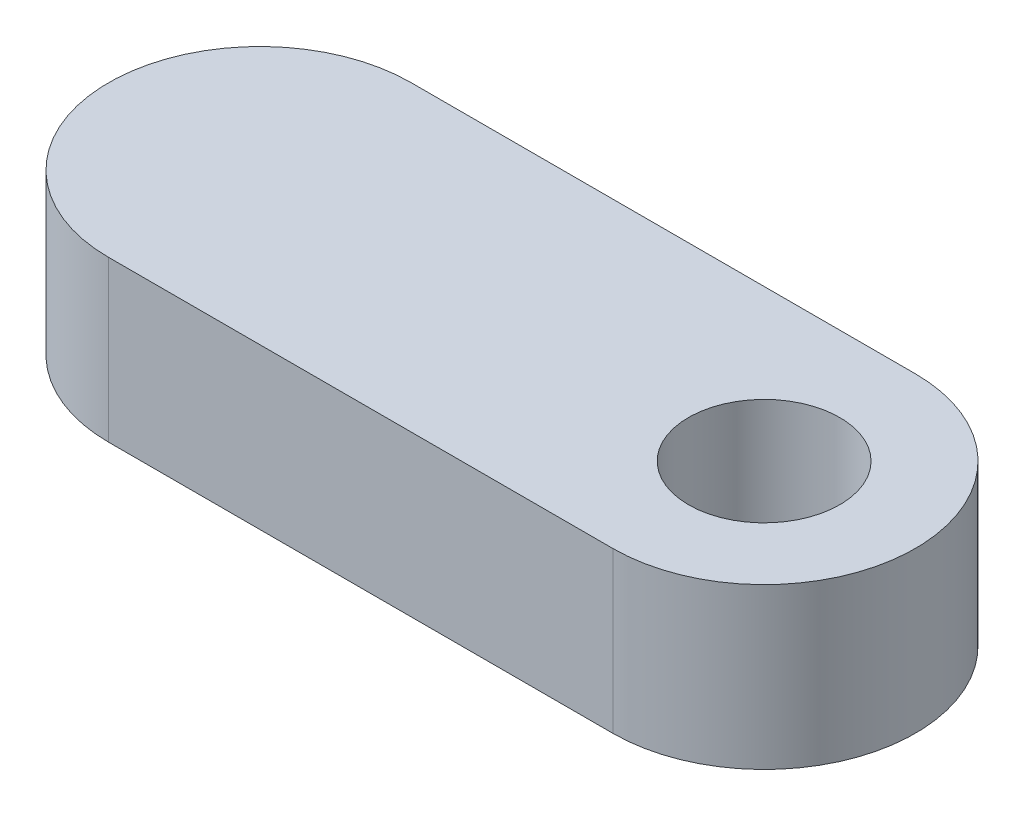
ISO-10303-21;
HEADER;
FILE_DESCRIPTION(('STEP AP214'),'2;1');
FILE_NAME('part.step','',(''),(''),'','','');
FILE_SCHEMA(('AUTOMOTIVE_DESIGN { 1 0 10303 214 1 1 1 1 }'));
ENDSEC;
DATA;
#1=APPLICATION_CONTEXT('core data for automotive mechanical design processes');
#2=APPLICATION_PROTOCOL_DEFINITION('international standard','automotive_design',2000,#1);
#3=PRODUCT_CONTEXT('',#1,'mechanical');
#4=PRODUCT('Part','Part','',(#3));
#5=PRODUCT_RELATED_PRODUCT_CATEGORY('part','',(#4));
#6=PRODUCT_DEFINITION_FORMATION('','',#4);
#7=PRODUCT_DEFINITION_CONTEXT('part definition',#1,'design');
#8=PRODUCT_DEFINITION('design','',#6,#7);
#9=PRODUCT_DEFINITION_SHAPE('','',#8);
#10=(LENGTH_UNIT() NAMED_UNIT(*) SI_UNIT(.MILLI.,.METRE.));
#11=(NAMED_UNIT(*) PLANE_ANGLE_UNIT() SI_UNIT($,.RADIAN.));
#12=(NAMED_UNIT(*) SI_UNIT($,.STERADIAN.) SOLID_ANGLE_UNIT());
#13=UNCERTAINTY_MEASURE_WITH_UNIT(LENGTH_MEASURE(1.E-05),#10,'distance_accuracy_value','');
#14=(GEOMETRIC_REPRESENTATION_CONTEXT(3) GLOBAL_UNCERTAINTY_ASSIGNED_CONTEXT((#13)) GLOBAL_UNIT_ASSIGNED_CONTEXT((#10,
#11,#12)) REPRESENTATION_CONTEXT('',''));
#15=CARTESIAN_POINT('',(0.,0.,0.));
#16=DIRECTION('',(0.,0.,1.));
#17=DIRECTION('',(1.,0.,0.));
#18=AXIS2_PLACEMENT_3D('',#15,#16,#17);
#19=CARTESIAN_POINT('',(-5.,3.175,0.));
#20=DIRECTION('',(0.,1.,0.));
#21=DIRECTION('',(0.,0.,1.));
#22=AXIS2_PLACEMENT_3D('',#19,#20,#21);
#23=PLANE('',#22);
#24=CARTESIAN_POINT('',(-5.,3.175,0.));
#25=DIRECTION('',(0.,1.,0.));
#26=DIRECTION('',(0.,0.,1.));
#27=AXIS2_PLACEMENT_3D('',#24,#25,#26);
#28=CIRCLE('',#27,3.);
#29=CARTESIAN_POINT('',(-5.,3.175,-3.));
#30=VERTEX_POINT('',#29);
#31=CARTESIAN_POINT('',(-5.,3.175,3.));
#32=VERTEX_POINT('',#31);
#33=EDGE_CURVE('E92',#30,#32,#28,.T.);
#34=ORIENTED_EDGE('',*,*,#33,.T.);
#35=DIRECTION('',(1.,0.,0.));
#36=VECTOR('',#35,1.);
#37=CARTESIAN_POINT('',(5.,3.175,3.));
#38=LINE('',#37,#36);
#39=CARTESIAN_POINT('',(5.,3.175,3.));
#40=VERTEX_POINT('',#39);
#41=EDGE_CURVE('E87',#32,#40,#38,.T.);
#42=ORIENTED_EDGE('',*,*,#41,.T.);
#43=CARTESIAN_POINT('',(5.,3.175,0.));
#44=DIRECTION('',(0.,1.,0.));
#45=DIRECTION('',(0.,0.,-1.));
#46=AXIS2_PLACEMENT_3D('',#43,#44,#45);
#47=CIRCLE('',#46,3.);
#48=CARTESIAN_POINT('',(5.,3.175,-3.));
#49=VERTEX_POINT('',#48);
#50=EDGE_CURVE('E90',#40,#49,#47,.T.);
#51=ORIENTED_EDGE('',*,*,#50,.T.);
#52=DIRECTION('',(-1.,0.,0.));
#53=VECTOR('',#52,1.);
#54=CARTESIAN_POINT('',(-5.,3.175,-3.));
#55=LINE('',#54,#53);
#56=EDGE_CURVE('E57',#49,#30,#55,.T.);
#57=ORIENTED_EDGE('',*,*,#56,.T.);
#58=EDGE_LOOP('',(#34,#42,#51,#57));
#59=FACE_BOUND('',#58,.T.);
#60=CARTESIAN_POINT('',(5.,3.175,0.));
#61=DIRECTION('',(0.,1.,0.));
#62=DIRECTION('',(0.,0.,1.));
#63=AXIS2_PLACEMENT_3D('',#60,#61,#62);
#64=CIRCLE('',#63,1.5);
#65=CARTESIAN_POINT('',(5.,3.175,1.5));
#66=VERTEX_POINT('',#65);
#67=EDGE_CURVE('E112',#66,#66,#64,.T.);
#68=ORIENTED_EDGE('',*,*,#67,.F.);
#69=EDGE_LOOP('',(#68));
#70=FACE_BOUND('',#69,.T.);
#71=ADVANCED_FACE('F39',(#59,#70),#23,.T.);
#72=CARTESIAN_POINT('',(-5.,0.,0.));
#73=DIRECTION('',(0.,1.,0.));
#74=DIRECTION('',(0.,0.,1.));
#75=AXIS2_PLACEMENT_3D('',#72,#73,#74);
#76=PLANE('',#75);
#77=CARTESIAN_POINT('',(-5.,0.,0.));
#78=DIRECTION('',(0.,1.,0.));
#79=DIRECTION('',(0.,0.,1.));
#80=AXIS2_PLACEMENT_3D('',#77,#78,#79);
#81=CIRCLE('',#80,3.);
#82=CARTESIAN_POINT('',(-5.,0.,-3.));
#83=VERTEX_POINT('',#82);
#84=CARTESIAN_POINT('',(-5.,0.,3.));
#85=VERTEX_POINT('',#84);
#86=EDGE_CURVE('E108',#83,#85,#81,.T.);
#87=ORIENTED_EDGE('',*,*,#86,.F.);
#88=DIRECTION('',(-1.,0.,0.));
#89=VECTOR('',#88,1.);
#90=CARTESIAN_POINT('',(-5.,0.,-3.));
#91=LINE('',#90,#89);
#92=CARTESIAN_POINT('',(5.,0.,-3.));
#93=VERTEX_POINT('',#92);
#94=EDGE_CURVE('E80',#93,#83,#91,.T.);
#95=ORIENTED_EDGE('',*,*,#94,.F.);
#96=CARTESIAN_POINT('',(5.,0.,0.));
#97=DIRECTION('',(0.,1.,0.));
#98=DIRECTION('',(0.,0.,-1.));
#99=AXIS2_PLACEMENT_3D('',#96,#97,#98);
#100=CIRCLE('',#99,3.);
#101=CARTESIAN_POINT('',(5.,0.,3.));
#102=VERTEX_POINT('',#101);
#103=EDGE_CURVE('E74',#102,#93,#100,.T.);
#104=ORIENTED_EDGE('',*,*,#103,.F.);
#105=DIRECTION('',(1.,0.,0.));
#106=VECTOR('',#105,1.);
#107=CARTESIAN_POINT('',(5.,0.,3.));
#108=LINE('',#107,#106);
#109=EDGE_CURVE('E97',#85,#102,#108,.T.);
#110=ORIENTED_EDGE('',*,*,#109,.F.);
#111=EDGE_LOOP('',(#87,#95,#104,#110));
#112=FACE_BOUND('',#111,.T.);
#113=CARTESIAN_POINT('',(5.,0.,0.));
#114=DIRECTION('',(0.,1.,0.));
#115=DIRECTION('',(0.,0.,1.));
#116=AXIS2_PLACEMENT_3D('',#113,#114,#115);
#117=CIRCLE('',#116,1.5);
#118=CARTESIAN_POINT('',(5.,0.,1.5));
#119=VERTEX_POINT('',#118);
#120=EDGE_CURVE('E130',#119,#119,#117,.T.);
#121=ORIENTED_EDGE('',*,*,#120,.T.);
#122=EDGE_LOOP('',(#121));
#123=FACE_BOUND('',#122,.T.);
#124=ADVANCED_FACE('F125',(#112,#123),#76,.F.);
#125=CARTESIAN_POINT('',(-5.,3.175,0.));
#126=DIRECTION('',(0.,-1.,0.));
#127=DIRECTION('',(0.,0.,-1.));
#128=AXIS2_PLACEMENT_3D('',#125,#126,#127);
#129=CYLINDRICAL_SURFACE('',#128,3.);
#130=ORIENTED_EDGE('',*,*,#86,.T.);
#131=DIRECTION('',(0.,-1.,0.));
#132=VECTOR('',#131,1.);
#133=CARTESIAN_POINT('',(-5.,3.175,3.));
#134=LINE('',#133,#132);
#135=EDGE_CURVE('E11',#32,#85,#134,.T.);
#136=ORIENTED_EDGE('',*,*,#135,.F.);
#137=ORIENTED_EDGE('',*,*,#33,.F.);
#138=DIRECTION('',(0.,-1.,0.));
#139=VECTOR('',#138,1.);
#140=CARTESIAN_POINT('',(-5.,3.175,-3.));
#141=LINE('',#140,#139);
#142=EDGE_CURVE('E104',#30,#83,#141,.T.);
#143=ORIENTED_EDGE('',*,*,#142,.T.);
#144=EDGE_LOOP('',(#130,#136,#137,#143));
#145=FACE_BOUND('',#144,.T.);
#146=ADVANCED_FACE('F41',(#145),#129,.T.);
#147=CARTESIAN_POINT('',(5.,3.175,3.));
#148=DIRECTION('',(0.,0.,-1.));
#149=DIRECTION('',(-1.,0.,0.));
#150=AXIS2_PLACEMENT_3D('',#147,#148,#149);
#151=PLANE('',#150);
#152=ORIENTED_EDGE('',*,*,#109,.T.);
#153=DIRECTION('',(0.,-1.,0.));
#154=VECTOR('',#153,1.);
#155=CARTESIAN_POINT('',(5.,3.175,3.));
#156=LINE('',#155,#154);
#157=EDGE_CURVE('E49',#40,#102,#156,.T.);
#158=ORIENTED_EDGE('',*,*,#157,.F.);
#159=ORIENTED_EDGE('',*,*,#41,.F.);
#160=ORIENTED_EDGE('',*,*,#135,.T.);
#161=EDGE_LOOP('',(#152,#158,#159,#160));
#162=FACE_BOUND('',#161,.T.);
#163=ADVANCED_FACE('F96',(#162),#151,.F.);
#164=CARTESIAN_POINT('',(5.,3.175,0.));
#165=DIRECTION('',(0.,-1.,0.));
#166=DIRECTION('',(0.,0.,-1.));
#167=AXIS2_PLACEMENT_3D('',#164,#165,#166);
#168=CYLINDRICAL_SURFACE('',#167,3.);
#169=ORIENTED_EDGE('',*,*,#103,.T.);
#170=DIRECTION('',(0.,-1.,0.));
#171=VECTOR('',#170,1.);
#172=CARTESIAN_POINT('',(5.,3.175,-3.));
#173=LINE('',#172,#171);
#174=EDGE_CURVE('E99',#49,#93,#173,.T.);
#175=ORIENTED_EDGE('',*,*,#174,.F.);
#176=ORIENTED_EDGE('',*,*,#50,.F.);
#177=ORIENTED_EDGE('',*,*,#157,.T.);
#178=EDGE_LOOP('',(#169,#175,#176,#177));
#179=FACE_BOUND('',#178,.T.);
#180=ADVANCED_FACE('F100',(#179),#168,.T.);
#181=CARTESIAN_POINT('',(-5.,3.175,-3.));
#182=DIRECTION('',(0.,0.,1.));
#183=DIRECTION('',(1.,0.,0.));
#184=AXIS2_PLACEMENT_3D('',#181,#182,#183);
#185=PLANE('',#184);
#186=ORIENTED_EDGE('',*,*,#94,.T.);
#187=ORIENTED_EDGE('',*,*,#142,.F.);
#188=ORIENTED_EDGE('',*,*,#56,.F.);
#189=ORIENTED_EDGE('',*,*,#174,.T.);
#190=EDGE_LOOP('',(#186,#187,#188,#189));
#191=FACE_BOUND('',#190,.T.);
#192=ADVANCED_FACE('F122',(#191),#185,.F.);
#193=CARTESIAN_POINT('',(5.,3.175,0.));
#194=DIRECTION('',(0.,-1.,0.));
#195=DIRECTION('',(0.,0.,-1.));
#196=AXIS2_PLACEMENT_3D('',#193,#194,#195);
#197=CYLINDRICAL_SURFACE('',#196,1.5);
#198=ORIENTED_EDGE('',*,*,#67,.T.);
#199=EDGE_LOOP('',(#198));
#200=FACE_BOUND('',#199,.T.);
#201=ORIENTED_EDGE('',*,*,#120,.F.);
#202=EDGE_LOOP('',(#201));
#203=FACE_BOUND('',#202,.T.);
#204=ADVANCED_FACE('F138',(#200,#203),#197,.F.);
#205=CLOSED_SHELL('',(#71,#124,#146,#163,#180,#192,#204));
#206=MANIFOLD_SOLID_BREP('B2',#205);
#207=ADVANCED_BREP_SHAPE_REPRESENTATION('',(#18,#206),#14);
#208=SHAPE_DEFINITION_REPRESENTATION(#9,#207);
ENDSEC;
END-ISO-10303-21;
